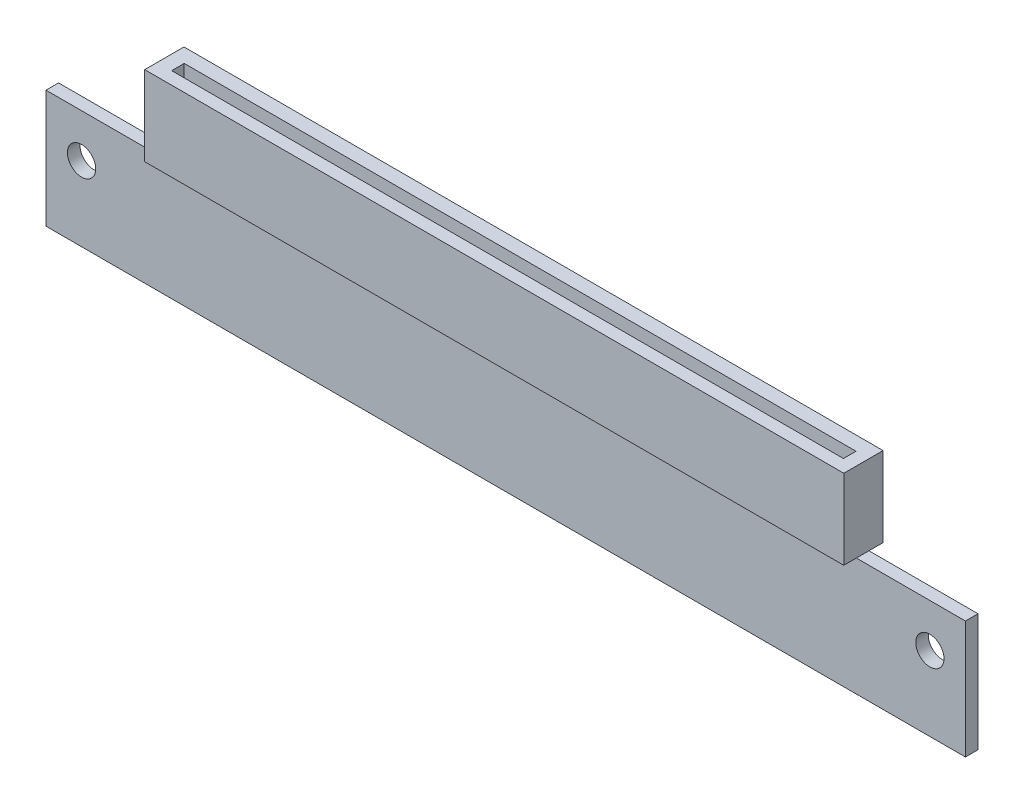
ISO-10303-21;
HEADER;
FILE_DESCRIPTION(('STEP AP214'),'2;1');
FILE_NAME('part.step','',(''),(''),'','','');
FILE_SCHEMA(('AUTOMOTIVE_DESIGN { 1 0 10303 214 1 1 1 1 }'));
ENDSEC;
DATA;
#1=APPLICATION_CONTEXT('core data for automotive mechanical design processes');
#2=APPLICATION_PROTOCOL_DEFINITION('international standard','automotive_design',2000,#1);
#3=PRODUCT_CONTEXT('',#1,'mechanical');
#4=PRODUCT('Part','Part','',(#3));
#5=PRODUCT_RELATED_PRODUCT_CATEGORY('part','',(#4));
#6=PRODUCT_DEFINITION_FORMATION('','',#4);
#7=PRODUCT_DEFINITION_CONTEXT('part definition',#1,'design');
#8=PRODUCT_DEFINITION('design','',#6,#7);
#9=PRODUCT_DEFINITION_SHAPE('','',#8);
#10=(LENGTH_UNIT() NAMED_UNIT(*) SI_UNIT(.MILLI.,.METRE.));
#11=(NAMED_UNIT(*) PLANE_ANGLE_UNIT() SI_UNIT($,.RADIAN.));
#12=(NAMED_UNIT(*) SI_UNIT($,.STERADIAN.) SOLID_ANGLE_UNIT());
#13=UNCERTAINTY_MEASURE_WITH_UNIT(LENGTH_MEASURE(1.E-05),#10,'distance_accuracy_value','');
#14=(GEOMETRIC_REPRESENTATION_CONTEXT(3) GLOBAL_UNCERTAINTY_ASSIGNED_CONTEXT((#13)) GLOBAL_UNIT_ASSIGNED_CONTEXT((#10,
#11,#12)) REPRESENTATION_CONTEXT('',''));
#15=CARTESIAN_POINT('',(0.,0.,0.));
#16=DIRECTION('',(0.,0.,1.));
#17=DIRECTION('',(1.,0.,0.));
#18=AXIS2_PLACEMENT_3D('',#15,#16,#17);
#19=CARTESIAN_POINT('',(0.,0.,0.));
#20=DIRECTION('',(0.,1.,0.));
#21=DIRECTION('',(0.,0.,1.));
#22=AXIS2_PLACEMENT_3D('',#19,#20,#21);
#23=PLANE('',#22);
#24=DIRECTION('',(1.,0.,0.));
#25=VECTOR('',#24,1.);
#26=CARTESIAN_POINT('',(-58.668,0.,-0.702447128958283));
#27=LINE('',#26,#25);
#28=CARTESIAN_POINT('',(-44.5,0.,-0.702447128958283));
#29=VERTEX_POINT('',#28);
#30=CARTESIAN_POINT('',(44.5,0.,-0.702447128958283));
#31=VERTEX_POINT('',#30);
#32=EDGE_CURVE('E11',#29,#31,#27,.T.);
#33=ORIENTED_EDGE('',*,*,#32,.F.);
#34=DIRECTION('',(0.,0.,1.));
#35=VECTOR('',#34,1.);
#36=CARTESIAN_POINT('',(-44.5,0.,-2.5));
#37=LINE('',#36,#35);
#38=CARTESIAN_POINT('',(-44.5,0.,-2.5));
#39=VERTEX_POINT('',#38);
#40=EDGE_CURVE('E228',#39,#29,#37,.T.);
#41=ORIENTED_EDGE('',*,*,#40,.F.);
#42=DIRECTION('',(-1.,0.,0.));
#43=VECTOR('',#42,1.);
#44=CARTESIAN_POINT('',(-44.5,0.,-2.5));
#45=LINE('',#44,#43);
#46=CARTESIAN_POINT('',(44.5,0.,-2.5));
#47=VERTEX_POINT('',#46);
#48=EDGE_CURVE('E224',#47,#39,#45,.T.);
#49=ORIENTED_EDGE('',*,*,#48,.F.);
#50=DIRECTION('',(0.,0.,-1.));
#51=VECTOR('',#50,1.);
#52=CARTESIAN_POINT('',(44.5,0.,-2.5));
#53=LINE('',#52,#51);
#54=EDGE_CURVE('E204',#31,#47,#53,.T.);
#55=ORIENTED_EDGE('',*,*,#54,.F.);
#56=EDGE_LOOP('',(#33,#41,#49,#55));
#57=FACE_BOUND('',#56,.T.);
#58=ADVANCED_FACE('F33',(#57),#23,.F.);
#59=CARTESIAN_POINT('',(44.5,10.14943,-2.5));
#60=DIRECTION('',(-1.,0.,0.));
#61=DIRECTION('',(0.,0.,1.));
#62=AXIS2_PLACEMENT_3D('',#59,#60,#61);
#63=PLANE('',#62);
#64=CARTESIAN_POINT('',(44.5,0.,2.5));
#65=VERTEX_POINT('',#64);
#66=CARTESIAN_POINT('',(44.5,0.,0.897552871041717));
#67=VERTEX_POINT('',#66);
#68=EDGE_CURVE('E221',#65,#67,#53,.T.);
#69=ORIENTED_EDGE('',*,*,#68,.T.);
#70=EDGE_CURVE('E225',#67,#31,#53,.T.);
#71=ORIENTED_EDGE('',*,*,#70,.T.);
#72=ORIENTED_EDGE('',*,*,#54,.T.);
#73=DIRECTION('',(0.,-1.,0.));
#74=VECTOR('',#73,1.);
#75=CARTESIAN_POINT('',(44.5,10.14943,-2.5));
#76=LINE('',#75,#74);
#77=CARTESIAN_POINT('',(44.5,10.14943,-2.5));
#78=VERTEX_POINT('',#77);
#79=EDGE_CURVE('E37',#78,#47,#76,.T.);
#80=ORIENTED_EDGE('',*,*,#79,.F.);
#81=DIRECTION('',(0.,0.,-1.));
#82=VECTOR('',#81,1.);
#83=CARTESIAN_POINT('',(44.5,10.14943,-2.5));
#84=LINE('',#83,#82);
#85=CARTESIAN_POINT('',(44.5,10.14943,2.5));
#86=VERTEX_POINT('',#85);
#87=EDGE_CURVE('E210',#86,#78,#84,.T.);
#88=ORIENTED_EDGE('',*,*,#87,.F.);
#89=DIRECTION('',(0.,-1.,0.));
#90=VECTOR('',#89,1.);
#91=CARTESIAN_POINT('',(44.5,10.14943,2.5));
#92=LINE('',#91,#90);
#93=EDGE_CURVE('E220',#86,#65,#92,.T.);
#94=ORIENTED_EDGE('',*,*,#93,.T.);
#95=EDGE_LOOP('',(#69,#71,#72,#80,#88,#94));
#96=FACE_BOUND('',#95,.T.);
#97=ADVANCED_FACE('F35',(#96),#63,.F.);
#98=CARTESIAN_POINT('',(-44.5,10.14943,-2.5));
#99=DIRECTION('',(0.,0.,1.));
#100=DIRECTION('',(1.,0.,0.));
#101=AXIS2_PLACEMENT_3D('',#98,#99,#100);
#102=PLANE('',#101);
#103=ORIENTED_EDGE('',*,*,#48,.T.);
#104=DIRECTION('',(0.,-1.,0.));
#105=VECTOR('',#104,1.);
#106=CARTESIAN_POINT('',(-44.5,10.14943,-2.5));
#107=LINE('',#106,#105);
#108=CARTESIAN_POINT('',(-44.5,10.14943,-2.5));
#109=VERTEX_POINT('',#108);
#110=EDGE_CURVE('E237',#109,#39,#107,.T.);
#111=ORIENTED_EDGE('',*,*,#110,.F.);
#112=DIRECTION('',(-1.,0.,0.));
#113=VECTOR('',#112,1.);
#114=CARTESIAN_POINT('',(-44.5,10.14943,-2.5));
#115=LINE('',#114,#113);
#116=EDGE_CURVE('E213',#78,#109,#115,.T.);
#117=ORIENTED_EDGE('',*,*,#116,.F.);
#118=ORIENTED_EDGE('',*,*,#79,.T.);
#119=EDGE_LOOP('',(#103,#111,#117,#118));
#120=FACE_BOUND('',#119,.T.);
#121=ADVANCED_FACE('F275',(#120),#102,.F.);
#122=CARTESIAN_POINT('',(-44.5,10.14943,-2.5));
#123=DIRECTION('',(1.,0.,0.));
#124=DIRECTION('',(0.,0.,-1.));
#125=AXIS2_PLACEMENT_3D('',#122,#123,#124);
#126=PLANE('',#125);
#127=ORIENTED_EDGE('',*,*,#40,.T.);
#128=CARTESIAN_POINT('',(-44.5,0.,0.897552871041717));
#129=VERTEX_POINT('',#128);
#130=EDGE_CURVE('E231',#29,#129,#37,.T.);
#131=ORIENTED_EDGE('',*,*,#130,.T.);
#132=CARTESIAN_POINT('',(-44.5,0.,2.5));
#133=VERTEX_POINT('',#132);
#134=EDGE_CURVE('E227',#129,#133,#37,.T.);
#135=ORIENTED_EDGE('',*,*,#134,.T.);
#136=DIRECTION('',(0.,-1.,0.));
#137=VECTOR('',#136,1.);
#138=CARTESIAN_POINT('',(-44.5,10.14943,2.5));
#139=LINE('',#138,#137);
#140=CARTESIAN_POINT('',(-44.5,10.14943,2.5));
#141=VERTEX_POINT('',#140);
#142=EDGE_CURVE('E235',#141,#133,#139,.T.);
#143=ORIENTED_EDGE('',*,*,#142,.F.);
#144=DIRECTION('',(0.,0.,1.));
#145=VECTOR('',#144,1.);
#146=CARTESIAN_POINT('',(-44.5,10.14943,-2.5));
#147=LINE('',#146,#145);
#148=EDGE_CURVE('E216',#109,#141,#147,.T.);
#149=ORIENTED_EDGE('',*,*,#148,.F.);
#150=ORIENTED_EDGE('',*,*,#110,.T.);
#151=EDGE_LOOP('',(#127,#131,#135,#143,#149,#150));
#152=FACE_BOUND('',#151,.T.);
#153=ADVANCED_FACE('F264',(#152),#126,.F.);
#154=CARTESIAN_POINT('',(-44.5,10.14943,2.5));
#155=DIRECTION('',(0.,0.,-1.));
#156=DIRECTION('',(-1.,0.,0.));
#157=AXIS2_PLACEMENT_3D('',#154,#155,#156);
#158=PLANE('',#157);
#159=DIRECTION('',(1.,0.,0.));
#160=VECTOR('',#159,1.);
#161=CARTESIAN_POINT('',(-44.5,0.,2.5));
#162=LINE('',#161,#160);
#163=EDGE_CURVE('E214',#133,#65,#162,.T.);
#164=ORIENTED_EDGE('',*,*,#163,.T.);
#165=ORIENTED_EDGE('',*,*,#93,.F.);
#166=DIRECTION('',(1.,0.,0.));
#167=VECTOR('',#166,1.);
#168=CARTESIAN_POINT('',(-44.5,10.14943,2.5));
#169=LINE('',#168,#167);
#170=EDGE_CURVE('E218',#141,#86,#169,.T.);
#171=ORIENTED_EDGE('',*,*,#170,.F.);
#172=ORIENTED_EDGE('',*,*,#142,.T.);
#173=EDGE_LOOP('',(#164,#165,#171,#172));
#174=FACE_BOUND('',#173,.T.);
#175=ADVANCED_FACE('F268',(#174),#158,.F.);
#176=CARTESIAN_POINT('',(0.,10.14943,0.));
#177=DIRECTION('',(0.,1.,0.));
#178=DIRECTION('',(0.,0.,1.));
#179=AXIS2_PLACEMENT_3D('',#176,#177,#178);
#180=PLANE('',#179);
#181=DIRECTION('',(0.,0.,-1.));
#182=VECTOR('',#181,1.);
#183=CARTESIAN_POINT('',(42.8547,10.14943,-0.702447128958283));
#184=LINE('',#183,#182);
#185=CARTESIAN_POINT('',(42.8547,10.14943,0.897552871041717));
#186=VERTEX_POINT('',#185);
#187=CARTESIAN_POINT('',(42.8547,10.14943,-0.702447128958283));
#188=VERTEX_POINT('',#187);
#189=EDGE_CURVE('E60',#186,#188,#184,.T.);
#190=ORIENTED_EDGE('',*,*,#189,.F.);
#191=DIRECTION('',(1.,0.,0.));
#192=VECTOR('',#191,1.);
#193=CARTESIAN_POINT('',(-42.6723,10.14943,0.897552871041717));
#194=LINE('',#193,#192);
#195=CARTESIAN_POINT('',(-42.6723,10.14943,0.897552871041717));
#196=VERTEX_POINT('',#195);
#197=EDGE_CURVE('E183',#196,#186,#194,.T.);
#198=ORIENTED_EDGE('',*,*,#197,.F.);
#199=DIRECTION('',(0.,0.,1.));
#200=VECTOR('',#199,1.);
#201=CARTESIAN_POINT('',(-42.6723,10.14943,-0.702447128958283));
#202=LINE('',#201,#200);
#203=CARTESIAN_POINT('',(-42.6723,10.14943,-0.702447128958283));
#204=VERTEX_POINT('',#203);
#205=EDGE_CURVE('E197',#204,#196,#202,.T.);
#206=ORIENTED_EDGE('',*,*,#205,.F.);
#207=DIRECTION('',(-1.,0.,0.));
#208=VECTOR('',#207,1.);
#209=CARTESIAN_POINT('',(-42.6723,10.14943,-0.702447128958283));
#210=LINE('',#209,#208);
#211=EDGE_CURVE('E194',#188,#204,#210,.T.);
#212=ORIENTED_EDGE('',*,*,#211,.F.);
#213=EDGE_LOOP('',(#190,#198,#206,#212));
#214=FACE_BOUND('',#213,.T.);
#215=ORIENTED_EDGE('',*,*,#87,.T.);
#216=ORIENTED_EDGE('',*,*,#116,.T.);
#217=ORIENTED_EDGE('',*,*,#148,.T.);
#218=ORIENTED_EDGE('',*,*,#170,.T.);
#219=EDGE_LOOP('',(#215,#216,#217,#218));
#220=FACE_BOUND('',#219,.T.);
#221=ADVANCED_FACE('F274',(#214,#220),#180,.T.);
#222=ORIENTED_EDGE('',*,*,#134,.F.);
#223=DIRECTION('',(1.,0.,0.));
#224=VECTOR('',#223,1.);
#225=CARTESIAN_POINT('',(-58.668,0.,0.897552871041717));
#226=LINE('',#225,#224);
#227=EDGE_CURVE('E42',#129,#67,#226,.T.);
#228=ORIENTED_EDGE('',*,*,#227,.T.);
#229=ORIENTED_EDGE('',*,*,#68,.F.);
#230=ORIENTED_EDGE('',*,*,#163,.F.);
#231=EDGE_LOOP('',(#222,#228,#229,#230));
#232=FACE_BOUND('',#231,.T.);
#233=ADVANCED_FACE('F270',(#232),#23,.F.);
#234=CARTESIAN_POINT('',(42.8547,2.39363,-0.702447128958283));
#235=DIRECTION('',(1.,0.,0.));
#236=DIRECTION('',(0.,0.,-1.));
#237=AXIS2_PLACEMENT_3D('',#234,#235,#236);
#238=PLANE('',#237);
#239=ORIENTED_EDGE('',*,*,#189,.T.);
#240=DIRECTION('',(0.,1.,0.));
#241=VECTOR('',#240,1.);
#242=CARTESIAN_POINT('',(42.8547,2.39363,-0.702447128958283));
#243=LINE('',#242,#241);
#244=CARTESIAN_POINT('',(42.8547,2.39363,-0.702447128958283));
#245=VERTEX_POINT('',#244);
#246=EDGE_CURVE('E192',#245,#188,#243,.T.);
#247=ORIENTED_EDGE('',*,*,#246,.F.);
#248=DIRECTION('',(0.,0.,-1.));
#249=VECTOR('',#248,1.);
#250=CARTESIAN_POINT('',(42.8547,2.39363,-0.702447128958283));
#251=LINE('',#250,#249);
#252=CARTESIAN_POINT('',(42.8547,2.39363,0.897552871041717));
#253=VERTEX_POINT('',#252);
#254=EDGE_CURVE('E179',#253,#245,#251,.T.);
#255=ORIENTED_EDGE('',*,*,#254,.F.);
#256=DIRECTION('',(0.,1.,0.));
#257=VECTOR('',#256,1.);
#258=CARTESIAN_POINT('',(42.8547,2.39363,0.897552871041717));
#259=LINE('',#258,#257);
#260=EDGE_CURVE('E202',#253,#186,#259,.T.);
#261=ORIENTED_EDGE('',*,*,#260,.T.);
#262=EDGE_LOOP('',(#239,#247,#255,#261));
#263=FACE_BOUND('',#262,.T.);
#264=ADVANCED_FACE('F287',(#263),#238,.F.);
#265=CARTESIAN_POINT('',(-42.6723,2.39363,0.897552871041717));
#266=DIRECTION('',(0.,0.,1.));
#267=DIRECTION('',(1.,0.,0.));
#268=AXIS2_PLACEMENT_3D('',#265,#266,#267);
#269=PLANE('',#268);
#270=ORIENTED_EDGE('',*,*,#197,.T.);
#271=ORIENTED_EDGE('',*,*,#260,.F.);
#272=DIRECTION('',(1.,0.,0.));
#273=VECTOR('',#272,1.);
#274=CARTESIAN_POINT('',(-42.6723,2.39363,0.897552871041717));
#275=LINE('',#274,#273);
#276=CARTESIAN_POINT('',(-42.6723,2.39363,0.897552871041717));
#277=VERTEX_POINT('',#276);
#278=EDGE_CURVE('E189',#277,#253,#275,.T.);
#279=ORIENTED_EDGE('',*,*,#278,.F.);
#280=DIRECTION('',(0.,1.,0.));
#281=VECTOR('',#280,1.);
#282=CARTESIAN_POINT('',(-42.6723,2.39363,0.897552871041717));
#283=LINE('',#282,#281);
#284=EDGE_CURVE('E205',#277,#196,#283,.T.);
#285=ORIENTED_EDGE('',*,*,#284,.T.);
#286=EDGE_LOOP('',(#270,#271,#279,#285));
#287=FACE_BOUND('',#286,.T.);
#288=ADVANCED_FACE('F292',(#287),#269,.F.);
#289=CARTESIAN_POINT('',(-42.6723,2.39363,-0.702447128958283));
#290=DIRECTION('',(-1.,0.,0.));
#291=DIRECTION('',(0.,0.,1.));
#292=AXIS2_PLACEMENT_3D('',#289,#290,#291);
#293=PLANE('',#292);
#294=ORIENTED_EDGE('',*,*,#205,.T.);
#295=ORIENTED_EDGE('',*,*,#284,.F.);
#296=DIRECTION('',(0.,0.,1.));
#297=VECTOR('',#296,1.);
#298=CARTESIAN_POINT('',(-42.6723,2.39363,-0.702447128958283));
#299=LINE('',#298,#297);
#300=CARTESIAN_POINT('',(-42.6723,2.39363,-0.702447128958283));
#301=VERTEX_POINT('',#300);
#302=EDGE_CURVE('E186',#301,#277,#299,.T.);
#303=ORIENTED_EDGE('',*,*,#302,.F.);
#304=DIRECTION('',(0.,1.,0.));
#305=VECTOR('',#304,1.);
#306=CARTESIAN_POINT('',(-42.6723,2.39363,-0.702447128958283));
#307=LINE('',#306,#305);
#308=EDGE_CURVE('E207',#301,#204,#307,.T.);
#309=ORIENTED_EDGE('',*,*,#308,.T.);
#310=EDGE_LOOP('',(#294,#295,#303,#309));
#311=FACE_BOUND('',#310,.T.);
#312=ADVANCED_FACE('F303',(#311),#293,.F.);
#313=CARTESIAN_POINT('',(-42.6723,2.39363,-0.702447128958283));
#314=DIRECTION('',(0.,0.,-1.));
#315=DIRECTION('',(-1.,0.,0.));
#316=AXIS2_PLACEMENT_3D('',#313,#314,#315);
#317=PLANE('',#316);
#318=ORIENTED_EDGE('',*,*,#211,.T.);
#319=ORIENTED_EDGE('',*,*,#308,.F.);
#320=DIRECTION('',(-1.,0.,0.));
#321=VECTOR('',#320,1.);
#322=CARTESIAN_POINT('',(-42.6723,2.39363,-0.702447128958283));
#323=LINE('',#322,#321);
#324=EDGE_CURVE('E182',#245,#301,#323,.T.);
#325=ORIENTED_EDGE('',*,*,#324,.F.);
#326=ORIENTED_EDGE('',*,*,#246,.T.);
#327=EDGE_LOOP('',(#318,#319,#325,#326));
#328=FACE_BOUND('',#327,.T.);
#329=ADVANCED_FACE('F299',(#328),#317,.F.);
#330=CARTESIAN_POINT('',(0.,2.39363,0.));
#331=DIRECTION('',(0.,1.,0.));
#332=DIRECTION('',(0.,0.,1.));
#333=AXIS2_PLACEMENT_3D('',#330,#331,#332);
#334=PLANE('',#333);
#335=ORIENTED_EDGE('',*,*,#254,.T.);
#336=ORIENTED_EDGE('',*,*,#324,.T.);
#337=ORIENTED_EDGE('',*,*,#302,.T.);
#338=ORIENTED_EDGE('',*,*,#278,.T.);
#339=EDGE_LOOP('',(#335,#336,#337,#338));
#340=FACE_BOUND('',#339,.T.);
#341=ADVANCED_FACE('F302',(#340),#334,.T.);
#342=CARTESIAN_POINT('',(0.,0.,0.));
#343=DIRECTION('',(0.,1.,0.));
#344=DIRECTION('',(0.,0.,1.));
#345=AXIS2_PLACEMENT_3D('',#342,#343,#344);
#346=PLANE('',#345);
#347=ORIENTED_EDGE('',*,*,#70,.F.);
#348=CARTESIAN_POINT('',(58.38358,0.,0.897552871041717));
#349=VERTEX_POINT('',#348);
#350=EDGE_CURVE('E52',#67,#349,#226,.T.);
#351=ORIENTED_EDGE('',*,*,#350,.T.);
#352=DIRECTION('',(0.,0.,-1.));
#353=VECTOR('',#352,1.);
#354=CARTESIAN_POINT('',(58.38358,0.,0.897552871041717));
#355=LINE('',#354,#353);
#356=CARTESIAN_POINT('',(58.38358,0.,-0.702447128958283));
#357=VERTEX_POINT('',#356);
#358=EDGE_CURVE('E169',#349,#357,#355,.T.);
#359=ORIENTED_EDGE('',*,*,#358,.T.);
#360=EDGE_CURVE('E45',#31,#357,#27,.T.);
#361=ORIENTED_EDGE('',*,*,#360,.F.);
#362=EDGE_LOOP('',(#347,#351,#359,#361));
#363=FACE_BOUND('',#362,.T.);
#364=ADVANCED_FACE('F251',(#363),#346,.T.);
#365=ORIENTED_EDGE('',*,*,#130,.F.);
#366=CARTESIAN_POINT('',(-58.668,0.,-0.702447128958283));
#367=VERTEX_POINT('',#366);
#368=EDGE_CURVE('E44',#367,#29,#27,.T.);
#369=ORIENTED_EDGE('',*,*,#368,.F.);
#370=DIRECTION('',(0.,0.,-1.));
#371=VECTOR('',#370,1.);
#372=CARTESIAN_POINT('',(-58.668,0.,0.897552871041717));
#373=LINE('',#372,#371);
#374=CARTESIAN_POINT('',(-58.668,0.,0.897552871041717));
#375=VERTEX_POINT('',#374);
#376=EDGE_CURVE('E150',#375,#367,#373,.T.);
#377=ORIENTED_EDGE('',*,*,#376,.F.);
#378=EDGE_CURVE('E171',#375,#129,#226,.T.);
#379=ORIENTED_EDGE('',*,*,#378,.T.);
#380=EDGE_LOOP('',(#365,#369,#377,#379));
#381=FACE_BOUND('',#380,.T.);
#382=ADVANCED_FACE('F261',(#381),#346,.T.);
#383=CARTESIAN_POINT('',(-58.668,-15.,-0.702447128958283));
#384=DIRECTION('',(0.,0.,1.));
#385=DIRECTION('',(1.,0.,0.));
#386=AXIS2_PLACEMENT_3D('',#383,#384,#385);
#387=PLANE('',#386);
#388=CARTESIAN_POINT('',(-54.14221,-5.5258,-0.702447128958283));
#389=DIRECTION('',(0.,0.,1.));
#390=DIRECTION('',(1.,0.,0.));
#391=AXIS2_PLACEMENT_3D('',#388,#389,#390);
#392=CIRCLE('',#391,1.8);
#393=CARTESIAN_POINT('',(-52.34221,-5.5258,-0.702447128958283));
#394=VERTEX_POINT('',#393);
#395=EDGE_CURVE('E340',#394,#394,#392,.T.);
#396=ORIENTED_EDGE('',*,*,#395,.T.);
#397=EDGE_LOOP('',(#396));
#398=FACE_BOUND('',#397,.T.);
#399=CARTESIAN_POINT('',(53.85779,-5.5258,-0.702447128958283));
#400=DIRECTION('',(0.,0.,1.));
#401=DIRECTION('',(1.,0.,0.));
#402=AXIS2_PLACEMENT_3D('',#399,#400,#401);
#403=CIRCLE('',#402,1.8);
#404=CARTESIAN_POINT('',(55.65779,-5.5258,-0.702447128958283));
#405=VERTEX_POINT('',#404);
#406=EDGE_CURVE('E349',#405,#405,#403,.T.);
#407=ORIENTED_EDGE('',*,*,#406,.T.);
#408=EDGE_LOOP('',(#407));
#409=FACE_BOUND('',#408,.T.);
#410=ORIENTED_EDGE('',*,*,#368,.T.);
#411=ORIENTED_EDGE('',*,*,#32,.T.);
#412=ORIENTED_EDGE('',*,*,#360,.T.);
#413=DIRECTION('',(0.,1.,0.));
#414=VECTOR('',#413,1.);
#415=CARTESIAN_POINT('',(58.38358,-15.,-0.702447128958283));
#416=LINE('',#415,#414);
#417=CARTESIAN_POINT('',(58.38358,-15.,-0.702447128958283));
#418=VERTEX_POINT('',#417);
#419=EDGE_CURVE('E153',#418,#357,#416,.T.);
#420=ORIENTED_EDGE('',*,*,#419,.F.);
#421=DIRECTION('',(1.,0.,0.));
#422=VECTOR('',#421,1.);
#423=CARTESIAN_POINT('',(-58.668,-15.,-0.702447128958283));
#424=LINE('',#423,#422);
#425=CARTESIAN_POINT('',(-58.668,-15.,-0.702447128958283));
#426=VERTEX_POINT('',#425);
#427=EDGE_CURVE('E138',#426,#418,#424,.T.);
#428=ORIENTED_EDGE('',*,*,#427,.F.);
#429=DIRECTION('',(0.,1.,0.));
#430=VECTOR('',#429,1.);
#431=CARTESIAN_POINT('',(-58.668,-15.,-0.702447128958283));
#432=LINE('',#431,#430);
#433=EDGE_CURVE('E167',#426,#367,#432,.T.);
#434=ORIENTED_EDGE('',*,*,#433,.T.);
#435=EDGE_LOOP('',(#410,#411,#412,#420,#428,#434));
#436=FACE_BOUND('',#435,.T.);
#437=ADVANCED_FACE('F155',(#398,#409,#436),#387,.F.);
#438=CARTESIAN_POINT('',(58.38358,-15.,0.897552871041717));
#439=DIRECTION('',(1.,0.,0.));
#440=DIRECTION('',(0.,0.,-1.));
#441=AXIS2_PLACEMENT_3D('',#438,#439,#440);
#442=PLANE('',#441);
#443=ORIENTED_EDGE('',*,*,#358,.F.);
#444=DIRECTION('',(0.,1.,0.));
#445=VECTOR('',#444,1.);
#446=CARTESIAN_POINT('',(58.38358,-15.,0.897552871041717));
#447=LINE('',#446,#445);
#448=CARTESIAN_POINT('',(58.38358,-15.,0.897552871041717));
#449=VERTEX_POINT('',#448);
#450=EDGE_CURVE('E159',#449,#349,#447,.T.);
#451=ORIENTED_EDGE('',*,*,#450,.F.);
#452=DIRECTION('',(0.,0.,-1.));
#453=VECTOR('',#452,1.);
#454=CARTESIAN_POINT('',(58.38358,-15.,0.897552871041717));
#455=LINE('',#454,#453);
#456=EDGE_CURVE('E143',#449,#418,#455,.T.);
#457=ORIENTED_EDGE('',*,*,#456,.T.);
#458=ORIENTED_EDGE('',*,*,#419,.T.);
#459=EDGE_LOOP('',(#443,#451,#457,#458));
#460=FACE_BOUND('',#459,.T.);
#461=ADVANCED_FACE('F161',(#460),#442,.T.);
#462=CARTESIAN_POINT('',(-58.668,-15.,0.897552871041717));
#463=DIRECTION('',(0.,0.,1.));
#464=DIRECTION('',(1.,0.,0.));
#465=AXIS2_PLACEMENT_3D('',#462,#463,#464);
#466=PLANE('',#465);
#467=CARTESIAN_POINT('',(-54.14221,-5.5258,0.897552871041717));
#468=DIRECTION('',(0.,0.,1.));
#469=DIRECTION('',(1.,0.,0.));
#470=AXIS2_PLACEMENT_3D('',#467,#468,#469);
#471=CIRCLE('',#470,1.8);
#472=CARTESIAN_POINT('',(-52.34221,-5.5258,0.897552871041717));
#473=VERTEX_POINT('',#472);
#474=EDGE_CURVE('E343',#473,#473,#471,.T.);
#475=ORIENTED_EDGE('',*,*,#474,.F.);
#476=EDGE_LOOP('',(#475));
#477=FACE_BOUND('',#476,.T.);
#478=CARTESIAN_POINT('',(53.85779,-5.5258,0.897552871041717));
#479=DIRECTION('',(0.,0.,1.));
#480=DIRECTION('',(1.,0.,0.));
#481=AXIS2_PLACEMENT_3D('',#478,#479,#480);
#482=CIRCLE('',#481,1.8);
#483=CARTESIAN_POINT('',(55.65779,-5.5258,0.897552871041717));
#484=VERTEX_POINT('',#483);
#485=EDGE_CURVE('E345',#484,#484,#482,.T.);
#486=ORIENTED_EDGE('',*,*,#485,.F.);
#487=EDGE_LOOP('',(#486));
#488=FACE_BOUND('',#487,.T.);
#489=ORIENTED_EDGE('',*,*,#378,.F.);
#490=DIRECTION('',(0.,1.,0.));
#491=VECTOR('',#490,1.);
#492=CARTESIAN_POINT('',(-58.668,-15.,0.897552871041717));
#493=LINE('',#492,#491);
#494=CARTESIAN_POINT('',(-58.668,-15.,0.897552871041717));
#495=VERTEX_POINT('',#494);
#496=EDGE_CURVE('E176',#495,#375,#493,.T.);
#497=ORIENTED_EDGE('',*,*,#496,.F.);
#498=DIRECTION('',(1.,0.,0.));
#499=VECTOR('',#498,1.);
#500=CARTESIAN_POINT('',(-58.668,-15.,0.897552871041717));
#501=LINE('',#500,#499);
#502=EDGE_CURVE('E162',#495,#449,#501,.T.);
#503=ORIENTED_EDGE('',*,*,#502,.T.);
#504=ORIENTED_EDGE('',*,*,#450,.T.);
#505=ORIENTED_EDGE('',*,*,#350,.F.);
#506=ORIENTED_EDGE('',*,*,#227,.F.);
#507=EDGE_LOOP('',(#489,#497,#503,#504,#505,#506));
#508=FACE_BOUND('',#507,.T.);
#509=ADVANCED_FACE('F254',(#477,#488,#508),#466,.T.);
#510=CARTESIAN_POINT('',(-58.668,-15.,0.897552871041717));
#511=DIRECTION('',(1.,0.,0.));
#512=DIRECTION('',(0.,0.,-1.));
#513=AXIS2_PLACEMENT_3D('',#510,#511,#512);
#514=PLANE('',#513);
#515=ORIENTED_EDGE('',*,*,#376,.T.);
#516=ORIENTED_EDGE('',*,*,#433,.F.);
#517=DIRECTION('',(0.,0.,-1.));
#518=VECTOR('',#517,1.);
#519=CARTESIAN_POINT('',(-58.668,-15.,0.897552871041717));
#520=LINE('',#519,#518);
#521=EDGE_CURVE('E146',#495,#426,#520,.T.);
#522=ORIENTED_EDGE('',*,*,#521,.F.);
#523=ORIENTED_EDGE('',*,*,#496,.T.);
#524=EDGE_LOOP('',(#515,#516,#522,#523));
#525=FACE_BOUND('',#524,.T.);
#526=ADVANCED_FACE('F257',(#525),#514,.F.);
#527=CARTESIAN_POINT('',(0.,-15.,0.));
#528=DIRECTION('',(0.,1.,0.));
#529=DIRECTION('',(0.,0.,1.));
#530=AXIS2_PLACEMENT_3D('',#527,#528,#529);
#531=PLANE('',#530);
#532=ORIENTED_EDGE('',*,*,#427,.T.);
#533=ORIENTED_EDGE('',*,*,#456,.F.);
#534=ORIENTED_EDGE('',*,*,#502,.F.);
#535=ORIENTED_EDGE('',*,*,#521,.T.);
#536=EDGE_LOOP('',(#532,#533,#534,#535));
#537=FACE_BOUND('',#536,.T.);
#538=ADVANCED_FACE('F140',(#537),#531,.F.);
#539=CARTESIAN_POINT('',(53.85779,-5.5258,0.897552871041717));
#540=DIRECTION('',(0.,0.,1.));
#541=DIRECTION('',(1.,0.,0.));
#542=AXIS2_PLACEMENT_3D('',#539,#540,#541);
#543=CYLINDRICAL_SURFACE('',#542,1.8);
#544=ORIENTED_EDGE('',*,*,#406,.F.);
#545=EDGE_LOOP('',(#544));
#546=FACE_BOUND('',#545,.T.);
#547=ORIENTED_EDGE('',*,*,#485,.T.);
#548=EDGE_LOOP('',(#547));
#549=FACE_BOUND('',#548,.T.);
#550=ADVANCED_FACE('F328',(#546,#549),#543,.F.);
#551=CARTESIAN_POINT('',(-54.14221,-5.5258,0.897552871041717));
#552=DIRECTION('',(0.,0.,1.));
#553=DIRECTION('',(1.,0.,0.));
#554=AXIS2_PLACEMENT_3D('',#551,#552,#553);
#555=CYLINDRICAL_SURFACE('',#554,1.8);
#556=ORIENTED_EDGE('',*,*,#395,.F.);
#557=EDGE_LOOP('',(#556));
#558=FACE_BOUND('',#557,.T.);
#559=ORIENTED_EDGE('',*,*,#474,.T.);
#560=EDGE_LOOP('',(#559));
#561=FACE_BOUND('',#560,.T.);
#562=ADVANCED_FACE('F331',(#558,#561),#555,.F.);
#563=CLOSED_SHELL('',(#58,#97,#121,#153,#175,#221,#233,#264,#288,#312,#329,#341,#364,#382,#437,
#461,#509,#526,#538,#550,#562));
#564=MANIFOLD_SOLID_BREP('B2',#563);
#565=ADVANCED_BREP_SHAPE_REPRESENTATION('',(#18,#564),#14);
#566=SHAPE_DEFINITION_REPRESENTATION(#9,#565);
ENDSEC;
END-ISO-10303-21;
